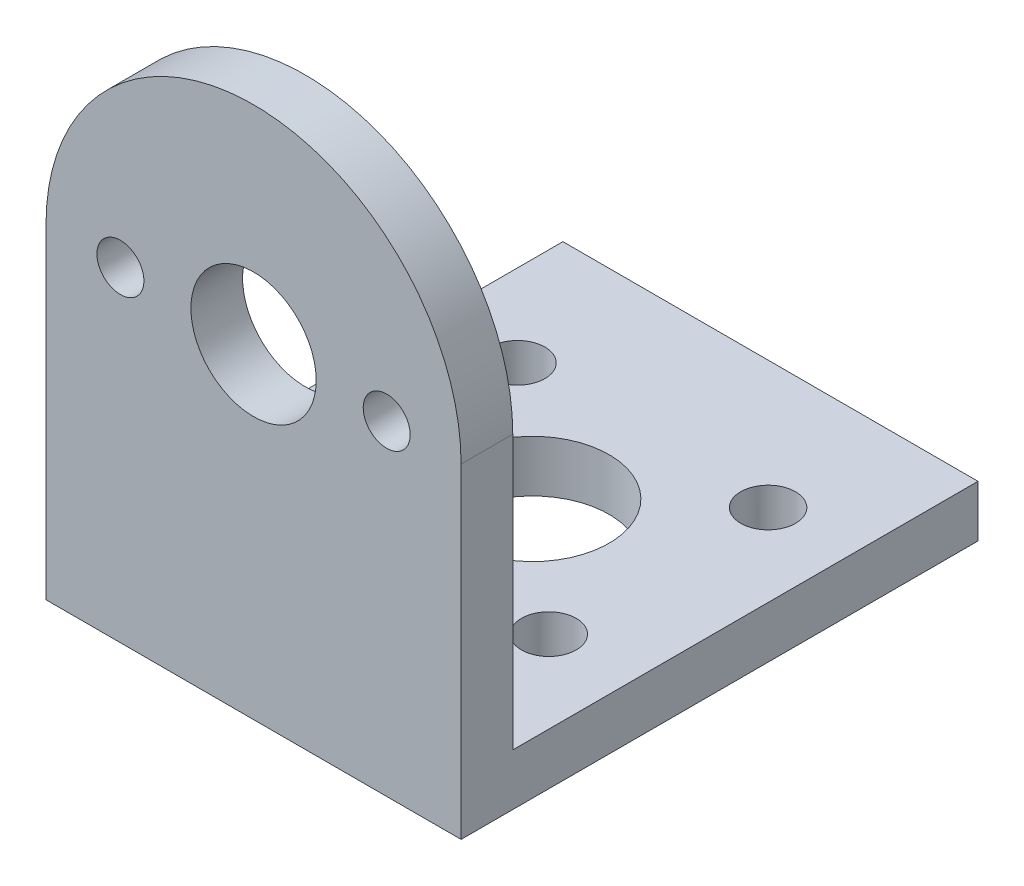
ISO-10303-21;
HEADER;
FILE_DESCRIPTION(('STEP AP214'),'2;1');
FILE_NAME('part.step','',(''),(''),'','','');
FILE_SCHEMA(('AUTOMOTIVE_DESIGN { 1 0 10303 214 1 1 1 1 }'));
ENDSEC;
DATA;
#1=APPLICATION_CONTEXT('core data for automotive mechanical design processes');
#2=APPLICATION_PROTOCOL_DEFINITION('international standard','automotive_design',2000,#1);
#3=PRODUCT_CONTEXT('',#1,'mechanical');
#4=PRODUCT('Part','Part','',(#3));
#5=PRODUCT_RELATED_PRODUCT_CATEGORY('part','',(#4));
#6=PRODUCT_DEFINITION_FORMATION('','',#4);
#7=PRODUCT_DEFINITION_CONTEXT('part definition',#1,'design');
#8=PRODUCT_DEFINITION('design','',#6,#7);
#9=PRODUCT_DEFINITION_SHAPE('','',#8);
#10=(LENGTH_UNIT() NAMED_UNIT(*) SI_UNIT(.MILLI.,.METRE.));
#11=(NAMED_UNIT(*) PLANE_ANGLE_UNIT() SI_UNIT($,.RADIAN.));
#12=(NAMED_UNIT(*) SI_UNIT($,.STERADIAN.) SOLID_ANGLE_UNIT());
#13=UNCERTAINTY_MEASURE_WITH_UNIT(LENGTH_MEASURE(1.E-05),#10,'distance_accuracy_value','');
#14=(GEOMETRIC_REPRESENTATION_CONTEXT(3) GLOBAL_UNCERTAINTY_ASSIGNED_CONTEXT((#13)) GLOBAL_UNIT_ASSIGNED_CONTEXT((#10,
#11,#12)) REPRESENTATION_CONTEXT('',''));
#15=CARTESIAN_POINT('',(0.,0.,0.));
#16=DIRECTION('',(0.,0.,1.));
#17=DIRECTION('',(1.,0.,0.));
#18=AXIS2_PLACEMENT_3D('',#15,#16,#17);
#19=CARTESIAN_POINT('',(0.,0.,0.));
#20=DIRECTION('',(0.,0.,-1.));
#21=DIRECTION('',(-1.,0.,0.));
#22=AXIS2_PLACEMENT_3D('',#19,#20,#21);
#23=PLANE('',#22);
#24=CARTESIAN_POINT('',(-8.5,0.,0.));
#25=DIRECTION('',(0.,0.,1.));
#26=DIRECTION('',(1.,0.,0.));
#27=AXIS2_PLACEMENT_3D('',#24,#25,#26);
#28=CIRCLE('',#27,1.5);
#29=CARTESIAN_POINT('',(-7.,0.,0.));
#30=VERTEX_POINT('',#29);
#31=EDGE_CURVE('E127',#30,#30,#28,.T.);
#32=ORIENTED_EDGE('',*,*,#31,.T.);
#33=EDGE_LOOP('',(#32));
#34=FACE_BOUND('',#33,.T.);
#35=CARTESIAN_POINT('',(0.,0.,0.));
#36=DIRECTION('',(0.,0.,1.));
#37=DIRECTION('',(1.,0.,0.));
#38=AXIS2_PLACEMENT_3D('',#35,#36,#37);
#39=CIRCLE('',#38,4.);
#40=CARTESIAN_POINT('',(4.,0.,0.));
#41=VERTEX_POINT('',#40);
#42=EDGE_CURVE('E133',#41,#41,#39,.T.);
#43=ORIENTED_EDGE('',*,*,#42,.T.);
#44=EDGE_LOOP('',(#43));
#45=FACE_BOUND('',#44,.T.);
#46=CARTESIAN_POINT('',(8.5,0.,0.));
#47=DIRECTION('',(0.,0.,1.));
#48=DIRECTION('',(-1.,0.,0.));
#49=AXIS2_PLACEMENT_3D('',#46,#47,#48);
#50=CIRCLE('',#49,1.5);
#51=CARTESIAN_POINT('',(7.,0.,0.));
#52=VERTEX_POINT('',#51);
#53=EDGE_CURVE('E122',#52,#52,#50,.T.);
#54=ORIENTED_EDGE('',*,*,#53,.T.);
#55=EDGE_LOOP('',(#54));
#56=FACE_BOUND('',#55,.T.);
#57=DIRECTION('',(0.,1.,0.));
#58=VECTOR('',#57,1.);
#59=CARTESIAN_POINT('',(13.25,0.,0.));
#60=LINE('',#59,#58);
#61=CARTESIAN_POINT('',(13.25,-17.45,0.));
#62=VERTEX_POINT('',#61);
#63=CARTESIAN_POINT('',(13.25,0.,0.));
#64=VERTEX_POINT('',#63);
#65=EDGE_CURVE('E73',#62,#64,#60,.T.);
#66=ORIENTED_EDGE('',*,*,#65,.F.);
#67=DIRECTION('',(-1.,0.,0.));
#68=VECTOR('',#67,1.);
#69=CARTESIAN_POINT('',(13.25,-17.45,0.));
#70=LINE('',#69,#68);
#71=CARTESIAN_POINT('',(-13.25,-17.45,0.));
#72=VERTEX_POINT('',#71);
#73=EDGE_CURVE('E97',#62,#72,#70,.T.);
#74=ORIENTED_EDGE('',*,*,#73,.T.);
#75=DIRECTION('',(0.,-1.,0.));
#76=VECTOR('',#75,1.);
#77=CARTESIAN_POINT('',(-13.25,0.,0.));
#78=LINE('',#77,#76);
#79=CARTESIAN_POINT('',(-13.25,0.,0.));
#80=VERTEX_POINT('',#79);
#81=EDGE_CURVE('E151',#80,#72,#78,.T.);
#82=ORIENTED_EDGE('',*,*,#81,.F.);
#83=CARTESIAN_POINT('',(0.,0.,0.));
#84=DIRECTION('',(0.,0.,1.));
#85=DIRECTION('',(-1.,0.,0.));
#86=AXIS2_PLACEMENT_3D('',#83,#84,#85);
#87=CIRCLE('',#86,13.25);
#88=EDGE_CURVE('E139',#64,#80,#87,.T.);
#89=ORIENTED_EDGE('',*,*,#88,.F.);
#90=EDGE_LOOP('',(#66,#74,#82,#89));
#91=FACE_BOUND('',#90,.T.);
#92=ADVANCED_FACE('F34',(#34,#45,#56,#91),#23,.T.);
#93=CARTESIAN_POINT('',(0.,0.,3.3));
#94=DIRECTION('',(0.,0.,-1.));
#95=DIRECTION('',(-1.,0.,0.));
#96=AXIS2_PLACEMENT_3D('',#93,#94,#95);
#97=PLANE('',#96);
#98=CARTESIAN_POINT('',(0.,0.,3.3));
#99=DIRECTION('',(0.,0.,1.));
#100=DIRECTION('',(-1.,0.,0.));
#101=AXIS2_PLACEMENT_3D('',#98,#99,#100);
#102=CIRCLE('',#101,13.25);
#103=CARTESIAN_POINT('',(13.25,0.,3.3));
#104=VERTEX_POINT('',#103);
#105=CARTESIAN_POINT('',(-13.25,0.,3.3));
#106=VERTEX_POINT('',#105);
#107=EDGE_CURVE('E142',#104,#106,#102,.T.);
#108=ORIENTED_EDGE('',*,*,#107,.T.);
#109=DIRECTION('',(0.,-1.,0.));
#110=VECTOR('',#109,1.);
#111=CARTESIAN_POINT('',(-13.25,0.,3.3));
#112=LINE('',#111,#110);
#113=CARTESIAN_POINT('',(-13.25,-20.75,3.3));
#114=VERTEX_POINT('',#113);
#115=EDGE_CURVE('E80',#106,#114,#112,.T.);
#116=ORIENTED_EDGE('',*,*,#115,.T.);
#117=DIRECTION('',(1.,0.,0.));
#118=VECTOR('',#117,1.);
#119=CARTESIAN_POINT('',(-13.25,-20.75,3.3));
#120=LINE('',#119,#118);
#121=CARTESIAN_POINT('',(13.25,-20.75,3.3));
#122=VERTEX_POINT('',#121);
#123=EDGE_CURVE('E145',#114,#122,#120,.T.);
#124=ORIENTED_EDGE('',*,*,#123,.T.);
#125=DIRECTION('',(0.,1.,0.));
#126=VECTOR('',#125,1.);
#127=CARTESIAN_POINT('',(13.25,0.,3.3));
#128=LINE('',#127,#126);
#129=EDGE_CURVE('E58',#122,#104,#128,.T.);
#130=ORIENTED_EDGE('',*,*,#129,.T.);
#131=EDGE_LOOP('',(#108,#116,#124,#130));
#132=FACE_BOUND('',#131,.T.);
#133=CARTESIAN_POINT('',(0.,0.,3.3));
#134=DIRECTION('',(0.,0.,1.));
#135=DIRECTION('',(1.,0.,0.));
#136=AXIS2_PLACEMENT_3D('',#133,#134,#135);
#137=CIRCLE('',#136,4.);
#138=CARTESIAN_POINT('',(4.,0.,3.3));
#139=VERTEX_POINT('',#138);
#140=EDGE_CURVE('E136',#139,#139,#137,.T.);
#141=ORIENTED_EDGE('',*,*,#140,.F.);
#142=EDGE_LOOP('',(#141));
#143=FACE_BOUND('',#142,.T.);
#144=CARTESIAN_POINT('',(-8.5,0.,3.3));
#145=DIRECTION('',(0.,0.,1.));
#146=DIRECTION('',(1.,0.,0.));
#147=AXIS2_PLACEMENT_3D('',#144,#145,#146);
#148=CIRCLE('',#147,1.5);
#149=CARTESIAN_POINT('',(-7.,0.,3.3));
#150=VERTEX_POINT('',#149);
#151=EDGE_CURVE('E130',#150,#150,#148,.T.);
#152=ORIENTED_EDGE('',*,*,#151,.F.);
#153=EDGE_LOOP('',(#152));
#154=FACE_BOUND('',#153,.T.);
#155=CARTESIAN_POINT('',(8.5,0.,3.3));
#156=DIRECTION('',(0.,0.,1.));
#157=DIRECTION('',(-1.,0.,0.));
#158=AXIS2_PLACEMENT_3D('',#155,#156,#157);
#159=CIRCLE('',#158,1.5);
#160=CARTESIAN_POINT('',(7.,0.,3.3));
#161=VERTEX_POINT('',#160);
#162=EDGE_CURVE('E124',#161,#161,#159,.T.);
#163=ORIENTED_EDGE('',*,*,#162,.F.);
#164=EDGE_LOOP('',(#163));
#165=FACE_BOUND('',#164,.T.);
#166=ADVANCED_FACE('F165',(#132,#143,#154,#165),#97,.F.);
#167=CARTESIAN_POINT('',(0.,0.,3.3));
#168=DIRECTION('',(0.,0.,-1.));
#169=DIRECTION('',(-1.,0.,0.));
#170=AXIS2_PLACEMENT_3D('',#167,#168,#169);
#171=CYLINDRICAL_SURFACE('',#170,13.25);
#172=ORIENTED_EDGE('',*,*,#88,.T.);
#173=DIRECTION('',(0.,0.,-1.));
#174=VECTOR('',#173,1.);
#175=CARTESIAN_POINT('',(-13.25,0.,3.3));
#176=LINE('',#175,#174);
#177=EDGE_CURVE('E11',#106,#80,#176,.T.);
#178=ORIENTED_EDGE('',*,*,#177,.F.);
#179=ORIENTED_EDGE('',*,*,#107,.F.);
#180=DIRECTION('',(0.,0.,-1.));
#181=VECTOR('',#180,1.);
#182=CARTESIAN_POINT('',(13.25,0.,3.3));
#183=LINE('',#182,#181);
#184=EDGE_CURVE('E148',#104,#64,#183,.T.);
#185=ORIENTED_EDGE('',*,*,#184,.T.);
#186=EDGE_LOOP('',(#172,#178,#179,#185));
#187=FACE_BOUND('',#186,.T.);
#188=ADVANCED_FACE('F36',(#187),#171,.T.);
#189=CARTESIAN_POINT('',(-13.25,0.,3.3));
#190=DIRECTION('',(1.,0.,0.));
#191=DIRECTION('',(0.,1.,0.));
#192=AXIS2_PLACEMENT_3D('',#189,#190,#191);
#193=PLANE('',#192);
#194=ORIENTED_EDGE('',*,*,#81,.T.);
#195=DIRECTION('',(0.,0.,1.));
#196=VECTOR('',#195,1.);
#197=CARTESIAN_POINT('',(-13.25,-17.45,-29.7));
#198=LINE('',#197,#196);
#199=CARTESIAN_POINT('',(-13.25,-17.45,-29.7));
#200=VERTEX_POINT('',#199);
#201=EDGE_CURVE('E49',#200,#72,#198,.T.);
#202=ORIENTED_EDGE('',*,*,#201,.F.);
#203=DIRECTION('',(0.,-1.,0.));
#204=VECTOR('',#203,1.);
#205=CARTESIAN_POINT('',(-13.25,-20.75,-29.7));
#206=LINE('',#205,#204);
#207=CARTESIAN_POINT('',(-13.25,-20.75,-29.7));
#208=VERTEX_POINT('',#207);
#209=EDGE_CURVE('E109',#200,#208,#206,.T.);
#210=ORIENTED_EDGE('',*,*,#209,.T.);
#211=DIRECTION('',(0.,0.,-1.));
#212=VECTOR('',#211,1.);
#213=CARTESIAN_POINT('',(-13.25,-20.75,3.3));
#214=LINE('',#213,#212);
#215=EDGE_CURVE('E42',#114,#208,#214,.T.);
#216=ORIENTED_EDGE('',*,*,#215,.F.);
#217=ORIENTED_EDGE('',*,*,#115,.F.);
#218=ORIENTED_EDGE('',*,*,#177,.T.);
#219=EDGE_LOOP('',(#194,#202,#210,#216,#217,#218));
#220=FACE_BOUND('',#219,.T.);
#221=ADVANCED_FACE('F159',(#220),#193,.F.);
#222=CARTESIAN_POINT('',(-13.25,-20.75,3.3));
#223=DIRECTION('',(0.,1.,0.));
#224=DIRECTION('',(0.,0.,1.));
#225=AXIS2_PLACEMENT_3D('',#222,#223,#224);
#226=PLANE('',#225);
#227=CARTESIAN_POINT('',(8.,-20.75,-21.55));
#228=DIRECTION('',(0.,1.,0.));
#229=DIRECTION('',(0.,0.,1.));
#230=AXIS2_PLACEMENT_3D('',#227,#228,#229);
#231=CIRCLE('',#230,1.75);
#232=CARTESIAN_POINT('',(8.,-20.75,-19.8));
#233=VERTEX_POINT('',#232);
#234=EDGE_CURVE('E330',#233,#233,#231,.F.);
#235=ORIENTED_EDGE('',*,*,#234,.F.);
#236=EDGE_LOOP('',(#235));
#237=FACE_BOUND('',#236,.T.);
#238=CARTESIAN_POINT('',(8.,-20.75,-7.55));
#239=DIRECTION('',(0.,1.,0.));
#240=DIRECTION('',(0.,0.,1.));
#241=AXIS2_PLACEMENT_3D('',#238,#239,#240);
#242=CIRCLE('',#241,1.75);
#243=CARTESIAN_POINT('',(8.,-20.75,-5.8));
#244=VERTEX_POINT('',#243);
#245=EDGE_CURVE('E338',#244,#244,#242,.F.);
#246=ORIENTED_EDGE('',*,*,#245,.F.);
#247=EDGE_LOOP('',(#246));
#248=FACE_BOUND('',#247,.T.);
#249=CARTESIAN_POINT('',(-7.99999999999999,-20.75,-7.55));
#250=DIRECTION('',(0.,1.,0.));
#251=DIRECTION('',(0.,0.,1.));
#252=AXIS2_PLACEMENT_3D('',#249,#250,#251);
#253=CIRCLE('',#252,1.75);
#254=CARTESIAN_POINT('',(-7.99999999999999,-20.75,-5.8));
#255=VERTEX_POINT('',#254);
#256=EDGE_CURVE('E351',#255,#255,#253,.F.);
#257=ORIENTED_EDGE('',*,*,#256,.F.);
#258=EDGE_LOOP('',(#257));
#259=FACE_BOUND('',#258,.T.);
#260=CARTESIAN_POINT('',(-8.,-20.75,-21.55));
#261=DIRECTION('',(0.,1.,0.));
#262=DIRECTION('',(0.,0.,1.));
#263=AXIS2_PLACEMENT_3D('',#260,#261,#262);
#264=CIRCLE('',#263,1.75);
#265=CARTESIAN_POINT('',(-8.,-20.75,-19.8));
#266=VERTEX_POINT('',#265);
#267=EDGE_CURVE('E342',#266,#266,#264,.F.);
#268=ORIENTED_EDGE('',*,*,#267,.F.);
#269=EDGE_LOOP('',(#268));
#270=FACE_BOUND('',#269,.T.);
#271=CARTESIAN_POINT('',(0.,-20.75,-14.5));
#272=DIRECTION('',(0.,1.,0.));
#273=DIRECTION('',(0.,0.,1.));
#274=AXIS2_PLACEMENT_3D('',#271,#272,#273);
#275=CIRCLE('',#274,4.9);
#276=CARTESIAN_POINT('',(0.,-20.75,-9.6));
#277=VERTEX_POINT('',#276);
#278=EDGE_CURVE('E115',#277,#277,#275,.F.);
#279=ORIENTED_EDGE('',*,*,#278,.F.);
#280=EDGE_LOOP('',(#279));
#281=FACE_BOUND('',#280,.T.);
#282=ORIENTED_EDGE('',*,*,#215,.T.);
#283=DIRECTION('',(1.,0.,0.));
#284=VECTOR('',#283,1.);
#285=CARTESIAN_POINT('',(13.25,-20.75,-29.7));
#286=LINE('',#285,#284);
#287=CARTESIAN_POINT('',(13.25,-20.75,-29.7));
#288=VERTEX_POINT('',#287);
#289=EDGE_CURVE('E99',#208,#288,#286,.T.);
#290=ORIENTED_EDGE('',*,*,#289,.T.);
#291=DIRECTION('',(0.,0.,-1.));
#292=VECTOR('',#291,1.);
#293=CARTESIAN_POINT('',(13.25,-20.75,3.3));
#294=LINE('',#293,#292);
#295=EDGE_CURVE('E113',#122,#288,#294,.T.);
#296=ORIENTED_EDGE('',*,*,#295,.F.);
#297=ORIENTED_EDGE('',*,*,#123,.F.);
#298=EDGE_LOOP('',(#282,#290,#296,#297));
#299=FACE_BOUND('',#298,.T.);
#300=ADVANCED_FACE('F158',(#237,#248,#259,#270,#281,#299),#226,.F.);
#301=CARTESIAN_POINT('',(13.25,0.,3.3));
#302=DIRECTION('',(-1.,0.,0.));
#303=DIRECTION('',(0.,-1.,0.));
#304=AXIS2_PLACEMENT_3D('',#301,#302,#303);
#305=PLANE('',#304);
#306=ORIENTED_EDGE('',*,*,#295,.T.);
#307=DIRECTION('',(0.,1.,0.));
#308=VECTOR('',#307,1.);
#309=CARTESIAN_POINT('',(13.25,-20.75,-29.7));
#310=LINE('',#309,#308);
#311=CARTESIAN_POINT('',(13.25,-17.45,-29.7));
#312=VERTEX_POINT('',#311);
#313=EDGE_CURVE('E106',#288,#312,#310,.T.);
#314=ORIENTED_EDGE('',*,*,#313,.T.);
#315=DIRECTION('',(0.,0.,1.));
#316=VECTOR('',#315,1.);
#317=CARTESIAN_POINT('',(13.25,-17.45,-29.7));
#318=LINE('',#317,#316);
#319=EDGE_CURVE('E93',#312,#62,#318,.T.);
#320=ORIENTED_EDGE('',*,*,#319,.T.);
#321=ORIENTED_EDGE('',*,*,#65,.T.);
#322=ORIENTED_EDGE('',*,*,#184,.F.);
#323=ORIENTED_EDGE('',*,*,#129,.F.);
#324=EDGE_LOOP('',(#306,#314,#320,#321,#322,#323));
#325=FACE_BOUND('',#324,.T.);
#326=ADVANCED_FACE('F111',(#325),#305,.F.);
#327=CARTESIAN_POINT('',(0.,0.,3.3));
#328=DIRECTION('',(0.,0.,-1.));
#329=DIRECTION('',(-1.,0.,0.));
#330=AXIS2_PLACEMENT_3D('',#327,#328,#329);
#331=CYLINDRICAL_SURFACE('',#330,4.);
#332=ORIENTED_EDGE('',*,*,#140,.T.);
#333=EDGE_LOOP('',(#332));
#334=FACE_BOUND('',#333,.T.);
#335=ORIENTED_EDGE('',*,*,#42,.F.);
#336=EDGE_LOOP('',(#335));
#337=FACE_BOUND('',#336,.T.);
#338=ADVANCED_FACE('F192',(#334,#337),#331,.F.);
#339=CARTESIAN_POINT('',(-8.5,0.,3.3));
#340=DIRECTION('',(0.,0.,-1.));
#341=DIRECTION('',(-1.,0.,0.));
#342=AXIS2_PLACEMENT_3D('',#339,#340,#341);
#343=CYLINDRICAL_SURFACE('',#342,1.5);
#344=ORIENTED_EDGE('',*,*,#151,.T.);
#345=EDGE_LOOP('',(#344));
#346=FACE_BOUND('',#345,.T.);
#347=ORIENTED_EDGE('',*,*,#31,.F.);
#348=EDGE_LOOP('',(#347));
#349=FACE_BOUND('',#348,.T.);
#350=ADVANCED_FACE('F178',(#346,#349),#343,.F.);
#351=CARTESIAN_POINT('',(8.5,0.,3.3));
#352=DIRECTION('',(0.,0.,-1.));
#353=DIRECTION('',(-1.,0.,0.));
#354=AXIS2_PLACEMENT_3D('',#351,#352,#353);
#355=CYLINDRICAL_SURFACE('',#354,1.5);
#356=ORIENTED_EDGE('',*,*,#162,.T.);
#357=EDGE_LOOP('',(#356));
#358=FACE_BOUND('',#357,.T.);
#359=ORIENTED_EDGE('',*,*,#53,.F.);
#360=EDGE_LOOP('',(#359));
#361=FACE_BOUND('',#360,.T.);
#362=ADVANCED_FACE('F175',(#358,#361),#355,.F.);
#363=CARTESIAN_POINT('',(13.25,-17.45,-29.7));
#364=DIRECTION('',(0.,1.,0.));
#365=DIRECTION('',(-1.,0.,0.));
#366=AXIS2_PLACEMENT_3D('',#363,#364,#365);
#367=PLANE('',#366);
#368=CARTESIAN_POINT('',(8.,-17.45,-21.55));
#369=DIRECTION('',(0.,1.,0.));
#370=DIRECTION('',(1.,0.,0.));
#371=AXIS2_PLACEMENT_3D('',#368,#369,#370);
#372=CIRCLE('',#371,1.75);
#373=CARTESIAN_POINT('',(9.75,-17.45,-21.55));
#374=VERTEX_POINT('',#373);
#375=EDGE_CURVE('E333',#374,#374,#372,.T.);
#376=ORIENTED_EDGE('',*,*,#375,.F.);
#377=EDGE_LOOP('',(#376));
#378=FACE_BOUND('',#377,.T.);
#379=CARTESIAN_POINT('',(8.,-17.45,-7.55));
#380=DIRECTION('',(0.,1.,0.));
#381=DIRECTION('',(1.,0.,0.));
#382=AXIS2_PLACEMENT_3D('',#379,#380,#381);
#383=CIRCLE('',#382,1.75);
#384=CARTESIAN_POINT('',(9.75,-17.45,-7.55));
#385=VERTEX_POINT('',#384);
#386=EDGE_CURVE('E335',#385,#385,#383,.T.);
#387=ORIENTED_EDGE('',*,*,#386,.F.);
#388=EDGE_LOOP('',(#387));
#389=FACE_BOUND('',#388,.T.);
#390=CARTESIAN_POINT('',(-7.99999999999999,-17.45,-7.55));
#391=DIRECTION('',(0.,1.,0.));
#392=DIRECTION('',(-1.,0.,0.));
#393=AXIS2_PLACEMENT_3D('',#390,#391,#392);
#394=CIRCLE('',#393,1.75);
#395=CARTESIAN_POINT('',(-9.74999999999999,-17.45,-7.55));
#396=VERTEX_POINT('',#395);
#397=EDGE_CURVE('E354',#396,#396,#394,.T.);
#398=ORIENTED_EDGE('',*,*,#397,.F.);
#399=EDGE_LOOP('',(#398));
#400=FACE_BOUND('',#399,.T.);
#401=CARTESIAN_POINT('',(-8.,-17.45,-21.55));
#402=DIRECTION('',(0.,1.,0.));
#403=DIRECTION('',(-1.,0.,0.));
#404=AXIS2_PLACEMENT_3D('',#401,#402,#403);
#405=CIRCLE('',#404,1.75);
#406=CARTESIAN_POINT('',(-9.75,-17.45,-21.55));
#407=VERTEX_POINT('',#406);
#408=EDGE_CURVE('E347',#407,#407,#405,.T.);
#409=ORIENTED_EDGE('',*,*,#408,.F.);
#410=EDGE_LOOP('',(#409));
#411=FACE_BOUND('',#410,.T.);
#412=CARTESIAN_POINT('',(0.,-17.45,-14.5));
#413=DIRECTION('',(0.,1.,0.));
#414=DIRECTION('',(-1.,0.,0.));
#415=AXIS2_PLACEMENT_3D('',#412,#413,#414);
#416=CIRCLE('',#415,4.9);
#417=CARTESIAN_POINT('',(-4.9,-17.45,-14.5));
#418=VERTEX_POINT('',#417);
#419=EDGE_CURVE('E340',#418,#418,#416,.T.);
#420=ORIENTED_EDGE('',*,*,#419,.F.);
#421=EDGE_LOOP('',(#420));
#422=FACE_BOUND('',#421,.T.);
#423=ORIENTED_EDGE('',*,*,#73,.F.);
#424=ORIENTED_EDGE('',*,*,#319,.F.);
#425=DIRECTION('',(-1.,0.,0.));
#426=VECTOR('',#425,1.);
#427=CARTESIAN_POINT('',(13.25,-17.45,-29.7));
#428=LINE('',#427,#426);
#429=EDGE_CURVE('E96',#312,#200,#428,.T.);
#430=ORIENTED_EDGE('',*,*,#429,.T.);
#431=ORIENTED_EDGE('',*,*,#201,.T.);
#432=EDGE_LOOP('',(#423,#424,#430,#431));
#433=FACE_BOUND('',#432,.T.);
#434=ADVANCED_FACE('F95',(#378,#389,#400,#411,#422,#433),#367,.T.);
#435=CARTESIAN_POINT('',(0.,0.,-29.7));
#436=DIRECTION('',(0.,0.,1.));
#437=DIRECTION('',(1.,0.,0.));
#438=AXIS2_PLACEMENT_3D('',#435,#436,#437);
#439=PLANE('',#438);
#440=ORIENTED_EDGE('',*,*,#313,.F.);
#441=ORIENTED_EDGE('',*,*,#289,.F.);
#442=ORIENTED_EDGE('',*,*,#209,.F.);
#443=ORIENTED_EDGE('',*,*,#429,.F.);
#444=EDGE_LOOP('',(#440,#441,#442,#443));
#445=FACE_BOUND('',#444,.T.);
#446=ADVANCED_FACE('F104',(#445),#439,.F.);
#447=CARTESIAN_POINT('',(0.,-34.6092929112563,-14.5));
#448=DIRECTION('',(0.,1.,0.));
#449=DIRECTION('',(-1.,0.,0.));
#450=AXIS2_PLACEMENT_3D('',#447,#448,#449);
#451=CYLINDRICAL_SURFACE('',#450,4.9);
#452=ORIENTED_EDGE('',*,*,#278,.T.);
#453=EDGE_LOOP('',(#452));
#454=FACE_BOUND('',#453,.T.);
#455=ORIENTED_EDGE('',*,*,#419,.T.);
#456=EDGE_LOOP('',(#455));
#457=FACE_BOUND('',#456,.T.);
#458=ADVANCED_FACE('F263',(#454,#457),#451,.F.);
#459=CARTESIAN_POINT('',(-7.99999999999999,-34.6092929112563,-21.55));
#460=DIRECTION('',(0.,1.,0.));
#461=DIRECTION('',(-1.,0.,0.));
#462=AXIS2_PLACEMENT_3D('',#459,#460,#461);
#463=CYLINDRICAL_SURFACE('',#462,1.75);
#464=ORIENTED_EDGE('',*,*,#267,.T.);
#465=EDGE_LOOP('',(#464));
#466=FACE_BOUND('',#465,.T.);
#467=ORIENTED_EDGE('',*,*,#408,.T.);
#468=EDGE_LOOP('',(#467));
#469=FACE_BOUND('',#468,.T.);
#470=ADVANCED_FACE('F283',(#466,#469),#463,.F.);
#471=CARTESIAN_POINT('',(-7.99999999999999,-34.6092929112563,-7.55));
#472=DIRECTION('',(0.,1.,0.));
#473=DIRECTION('',(-1.,0.,0.));
#474=AXIS2_PLACEMENT_3D('',#471,#472,#473);
#475=CYLINDRICAL_SURFACE('',#474,1.75);
#476=ORIENTED_EDGE('',*,*,#256,.T.);
#477=EDGE_LOOP('',(#476));
#478=FACE_BOUND('',#477,.T.);
#479=ORIENTED_EDGE('',*,*,#397,.T.);
#480=EDGE_LOOP('',(#479));
#481=FACE_BOUND('',#480,.T.);
#482=ADVANCED_FACE('F293',(#478,#481),#475,.F.);
#483=CARTESIAN_POINT('',(8.,-34.6092929112563,-7.55));
#484=DIRECTION('',(0.,1.,0.));
#485=DIRECTION('',(-1.,0.,0.));
#486=AXIS2_PLACEMENT_3D('',#483,#484,#485);
#487=CYLINDRICAL_SURFACE('',#486,1.75);
#488=ORIENTED_EDGE('',*,*,#245,.T.);
#489=EDGE_LOOP('',(#488));
#490=FACE_BOUND('',#489,.T.);
#491=ORIENTED_EDGE('',*,*,#386,.T.);
#492=EDGE_LOOP('',(#491));
#493=FACE_BOUND('',#492,.T.);
#494=ADVANCED_FACE('F303',(#490,#493),#487,.F.);
#495=CARTESIAN_POINT('',(8.,-34.6092929112563,-21.55));
#496=DIRECTION('',(0.,1.,0.));
#497=DIRECTION('',(-1.,0.,0.));
#498=AXIS2_PLACEMENT_3D('',#495,#496,#497);
#499=CYLINDRICAL_SURFACE('',#498,1.75);
#500=ORIENTED_EDGE('',*,*,#234,.T.);
#501=EDGE_LOOP('',(#500));
#502=FACE_BOUND('',#501,.T.);
#503=ORIENTED_EDGE('',*,*,#375,.T.);
#504=EDGE_LOOP('',(#503));
#505=FACE_BOUND('',#504,.T.);
#506=ADVANCED_FACE('F313',(#502,#505),#499,.F.);
#507=CLOSED_SHELL('',(#92,#166,#188,#221,#300,#326,#338,#350,#362,#434,#446,#458,#470,#482,#494,#506));
#508=MANIFOLD_SOLID_BREP('B2',#507);
#509=ADVANCED_BREP_SHAPE_REPRESENTATION('',(#18,#508),#14);
#510=SHAPE_DEFINITION_REPRESENTATION(#9,#509);
ENDSEC;
END-ISO-10303-21;
